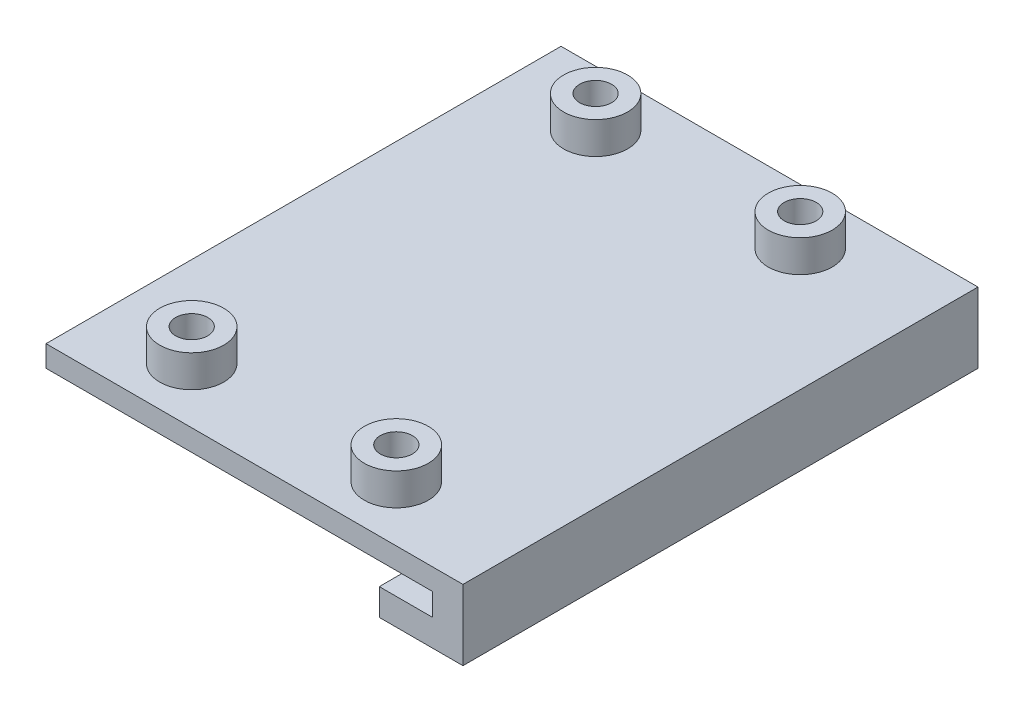
ISO-10303-21;
HEADER;
FILE_DESCRIPTION(('STEP AP214'),'2;1');
FILE_NAME('part.step','',(''),(''),'','','');
FILE_SCHEMA(('AUTOMOTIVE_DESIGN { 1 0 10303 214 1 1 1 1 }'));
ENDSEC;
DATA;
#1=APPLICATION_CONTEXT('core data for automotive mechanical design processes');
#2=APPLICATION_PROTOCOL_DEFINITION('international standard','automotive_design',2000,#1);
#3=PRODUCT_CONTEXT('',#1,'mechanical');
#4=PRODUCT('Part','Part','',(#3));
#5=PRODUCT_RELATED_PRODUCT_CATEGORY('part','',(#4));
#6=PRODUCT_DEFINITION_FORMATION('','',#4);
#7=PRODUCT_DEFINITION_CONTEXT('part definition',#1,'design');
#8=PRODUCT_DEFINITION('design','',#6,#7);
#9=PRODUCT_DEFINITION_SHAPE('','',#8);
#10=(LENGTH_UNIT() NAMED_UNIT(*) SI_UNIT(.MILLI.,.METRE.));
#11=(NAMED_UNIT(*) PLANE_ANGLE_UNIT() SI_UNIT($,.RADIAN.));
#12=(NAMED_UNIT(*) SI_UNIT($,.STERADIAN.) SOLID_ANGLE_UNIT());
#13=UNCERTAINTY_MEASURE_WITH_UNIT(LENGTH_MEASURE(1.E-05),#10,'distance_accuracy_value','');
#14=(GEOMETRIC_REPRESENTATION_CONTEXT(3) GLOBAL_UNCERTAINTY_ASSIGNED_CONTEXT((#13)) GLOBAL_UNIT_ASSIGNED_CONTEXT((#10,
#11,#12)) REPRESENTATION_CONTEXT('',''));
#15=CARTESIAN_POINT('',(0.,0.,0.));
#16=DIRECTION('',(0.,0.,1.));
#17=DIRECTION('',(1.,0.,0.));
#18=AXIS2_PLACEMENT_3D('',#15,#16,#17);
#19=CARTESIAN_POINT('',(18.194405421184,-4.6,-24.13));
#20=DIRECTION('',(1.,0.,0.));
#21=DIRECTION('',(0.,0.,-1.));
#22=AXIS2_PLACEMENT_3D('',#19,#20,#21);
#23=PLANE('',#22);
#24=DIRECTION('',(0.,0.,-1.));
#25=VECTOR('',#24,1.);
#26=CARTESIAN_POINT('',(18.194405421184,-2.1,24.13));
#27=LINE('',#26,#25);
#28=CARTESIAN_POINT('',(18.194405421184,-2.1,24.13));
#29=VERTEX_POINT('',#28);
#30=CARTESIAN_POINT('',(18.194405421184,-2.10000000000001,-24.13));
#31=VERTEX_POINT('',#30);
#32=EDGE_CURVE('E206',#29,#31,#27,.T.);
#33=ORIENTED_EDGE('',*,*,#32,.F.);
#34=DIRECTION('',(0.,1.,0.));
#35=VECTOR('',#34,1.);
#36=CARTESIAN_POINT('',(18.194405421184,-4.6,24.13));
#37=LINE('',#36,#35);
#38=CARTESIAN_POINT('',(18.194405421184,0.,24.13));
#39=VERTEX_POINT('',#38);
#40=EDGE_CURVE('E48',#29,#39,#37,.T.);
#41=ORIENTED_EDGE('',*,*,#40,.T.);
#42=DIRECTION('',(0.,0.,-1.));
#43=VECTOR('',#42,1.);
#44=CARTESIAN_POINT('',(18.194405421184,0.,-24.13));
#45=LINE('',#44,#43);
#46=CARTESIAN_POINT('',(18.194405421184,0.,-24.13));
#47=VERTEX_POINT('',#46);
#48=EDGE_CURVE('E90',#39,#47,#45,.T.);
#49=ORIENTED_EDGE('',*,*,#48,.T.);
#50=DIRECTION('',(0.,1.,0.));
#51=VECTOR('',#50,1.);
#52=CARTESIAN_POINT('',(18.194405421184,-4.6,-24.13));
#53=LINE('',#52,#51);
#54=EDGE_CURVE('E181',#31,#47,#53,.T.);
#55=ORIENTED_EDGE('',*,*,#54,.F.);
#56=EDGE_LOOP('',(#33,#41,#49,#55));
#57=FACE_BOUND('',#56,.T.);
#58=ADVANCED_FACE('F33',(#57),#23,.F.);
#59=CARTESIAN_POINT('',(0.,0.,0.));
#60=DIRECTION('',(0.,1.,0.));
#61=DIRECTION('',(0.,0.,1.));
#62=AXIS2_PLACEMENT_3D('',#59,#60,#61);
#63=PLANE('',#62);
#64=CARTESIAN_POINT('',(9.58566909872616,0.,-18.921));
#65=DIRECTION('',(0.,1.,0.));
#66=DIRECTION('',(0.,0.,1.));
#67=AXIS2_PLACEMENT_3D('',#64,#65,#66);
#68=CIRCLE('',#67,1.5);
#69=CARTESIAN_POINT('',(9.58566909872616,0.,-17.421));
#70=VERTEX_POINT('',#69);
#71=EDGE_CURVE('E162',#70,#70,#68,.T.);
#72=ORIENTED_EDGE('',*,*,#71,.T.);
#73=EDGE_LOOP('',(#72));
#74=FACE_BOUND('',#73,.T.);
#75=CARTESIAN_POINT('',(9.58566909872616,0.,18.925));
#76=DIRECTION('',(0.,1.,0.));
#77=DIRECTION('',(0.,0.,1.));
#78=AXIS2_PLACEMENT_3D('',#75,#76,#77);
#79=CIRCLE('',#78,1.5);
#80=CARTESIAN_POINT('',(9.58566909872616,0.,20.425));
#81=VERTEX_POINT('',#80);
#82=EDGE_CURVE('E156',#81,#81,#79,.T.);
#83=ORIENTED_EDGE('',*,*,#82,.T.);
#84=EDGE_LOOP('',(#83));
#85=FACE_BOUND('',#84,.T.);
#86=CARTESIAN_POINT('',(-9.58566909872616,0.,-18.921));
#87=DIRECTION('',(0.,-1.,0.));
#88=DIRECTION('',(0.,0.,1.));
#89=AXIS2_PLACEMENT_3D('',#86,#87,#88);
#90=CIRCLE('',#89,1.5);
#91=CARTESIAN_POINT('',(-9.58566909872616,0.,-17.421));
#92=VERTEX_POINT('',#91);
#93=EDGE_CURVE('E144',#92,#92,#90,.T.);
#94=ORIENTED_EDGE('',*,*,#93,.F.);
#95=EDGE_LOOP('',(#94));
#96=FACE_BOUND('',#95,.T.);
#97=CARTESIAN_POINT('',(-9.58566909872616,0.,18.925));
#98=DIRECTION('',(0.,-1.,0.));
#99=DIRECTION('',(0.,0.,1.));
#100=AXIS2_PLACEMENT_3D('',#97,#98,#99);
#101=CIRCLE('',#100,1.5);
#102=CARTESIAN_POINT('',(-9.58566909872616,0.,20.425));
#103=VERTEX_POINT('',#102);
#104=EDGE_CURVE('E137',#103,#103,#101,.T.);
#105=ORIENTED_EDGE('',*,*,#104,.F.);
#106=EDGE_LOOP('',(#105));
#107=FACE_BOUND('',#106,.T.);
#108=ORIENTED_EDGE('',*,*,#48,.F.);
#109=DIRECTION('',(1.,0.,0.));
#110=VECTOR('',#109,1.);
#111=CARTESIAN_POINT('',(-18.034,0.,24.13));
#112=LINE('',#111,#110);
#113=CARTESIAN_POINT('',(-18.034,0.,24.13));
#114=VERTEX_POINT('',#113);
#115=EDGE_CURVE('E80',#114,#39,#112,.T.);
#116=ORIENTED_EDGE('',*,*,#115,.F.);
#117=DIRECTION('',(0.,0.,1.));
#118=VECTOR('',#117,1.);
#119=CARTESIAN_POINT('',(-18.034,0.,-24.13));
#120=LINE('',#119,#118);
#121=CARTESIAN_POINT('',(-18.034,0.,-24.13));
#122=VERTEX_POINT('',#121);
#123=EDGE_CURVE('E70',#122,#114,#120,.T.);
#124=ORIENTED_EDGE('',*,*,#123,.F.);
#125=DIRECTION('',(-1.,0.,0.));
#126=VECTOR('',#125,1.);
#127=CARTESIAN_POINT('',(-18.034,0.,-24.13));
#128=LINE('',#127,#126);
#129=EDGE_CURVE('E81',#47,#122,#128,.T.);
#130=ORIENTED_EDGE('',*,*,#129,.F.);
#131=EDGE_LOOP('',(#108,#116,#124,#130));
#132=FACE_BOUND('',#131,.T.);
#133=ADVANCED_FACE('F89',(#74,#85,#96,#107,#132),#63,.F.);
#134=CARTESIAN_POINT('',(-18.034,2.,-24.13));
#135=DIRECTION('',(0.,0.,1.));
#136=DIRECTION('',(1.,0.,0.));
#137=AXIS2_PLACEMENT_3D('',#134,#135,#136);
#138=PLANE('',#137);
#139=DIRECTION('',(0.,1.,0.));
#140=VECTOR('',#139,1.);
#141=CARTESIAN_POINT('',(21.034,2.,-24.13));
#142=LINE('',#141,#140);
#143=CARTESIAN_POINT('',(21.034,-4.6,-24.13));
#144=VERTEX_POINT('',#143);
#145=CARTESIAN_POINT('',(21.034,2.,-24.13));
#146=VERTEX_POINT('',#145);
#147=EDGE_CURVE('E128',#144,#146,#142,.T.);
#148=ORIENTED_EDGE('',*,*,#147,.F.);
#149=DIRECTION('',(1.,0.,0.));
#150=VECTOR('',#149,1.);
#151=CARTESIAN_POINT('',(21.034,-4.6,-24.13));
#152=LINE('',#151,#150);
#153=CARTESIAN_POINT('',(13.194405421184,-4.6,-24.13));
#154=VERTEX_POINT('',#153);
#155=EDGE_CURVE('E194',#154,#144,#152,.T.);
#156=ORIENTED_EDGE('',*,*,#155,.F.);
#157=DIRECTION('',(0.,-1.,0.));
#158=VECTOR('',#157,1.);
#159=CARTESIAN_POINT('',(13.194405421184,-4.6,-24.13));
#160=LINE('',#159,#158);
#161=CARTESIAN_POINT('',(13.194405421184,-2.10000000000001,-24.13));
#162=VERTEX_POINT('',#161);
#163=EDGE_CURVE('E211',#162,#154,#160,.T.);
#164=ORIENTED_EDGE('',*,*,#163,.F.);
#165=DIRECTION('',(1.,0.,0.));
#166=VECTOR('',#165,1.);
#167=CARTESIAN_POINT('',(13.194405421184,-2.10000000000001,-24.13));
#168=LINE('',#167,#166);
#169=EDGE_CURVE('E190',#162,#31,#168,.T.);
#170=ORIENTED_EDGE('',*,*,#169,.T.);
#171=ORIENTED_EDGE('',*,*,#54,.T.);
#172=ORIENTED_EDGE('',*,*,#129,.T.);
#173=DIRECTION('',(0.,-1.,0.));
#174=VECTOR('',#173,1.);
#175=CARTESIAN_POINT('',(-18.034,2.,-24.13));
#176=LINE('',#175,#174);
#177=CARTESIAN_POINT('',(-18.034,2.,-24.13));
#178=VERTEX_POINT('',#177);
#179=EDGE_CURVE('E76',#178,#122,#176,.T.);
#180=ORIENTED_EDGE('',*,*,#179,.F.);
#181=DIRECTION('',(-1.,0.,0.));
#182=VECTOR('',#181,1.);
#183=CARTESIAN_POINT('',(-18.034,2.,-24.13));
#184=LINE('',#183,#182);
#185=EDGE_CURVE('E91',#146,#178,#184,.T.);
#186=ORIENTED_EDGE('',*,*,#185,.F.);
#187=EDGE_LOOP('',(#148,#156,#164,#170,#171,#172,#180,#186));
#188=FACE_BOUND('',#187,.T.);
#189=ADVANCED_FACE('F35',(#188),#138,.F.);
#190=CARTESIAN_POINT('',(-18.034,2.,-24.13));
#191=DIRECTION('',(1.,0.,0.));
#192=DIRECTION('',(0.,0.,-1.));
#193=AXIS2_PLACEMENT_3D('',#190,#191,#192);
#194=PLANE('',#193);
#195=ORIENTED_EDGE('',*,*,#123,.T.);
#196=DIRECTION('',(0.,-1.,0.));
#197=VECTOR('',#196,1.);
#198=CARTESIAN_POINT('',(-18.034,2.,24.13));
#199=LINE('',#198,#197);
#200=CARTESIAN_POINT('',(-18.034,2.,24.13));
#201=VERTEX_POINT('',#200);
#202=EDGE_CURVE('E73',#201,#114,#199,.T.);
#203=ORIENTED_EDGE('',*,*,#202,.F.);
#204=DIRECTION('',(0.,0.,1.));
#205=VECTOR('',#204,1.);
#206=CARTESIAN_POINT('',(-18.034,2.,-24.13));
#207=LINE('',#206,#205);
#208=EDGE_CURVE('E57',#178,#201,#207,.T.);
#209=ORIENTED_EDGE('',*,*,#208,.F.);
#210=ORIENTED_EDGE('',*,*,#179,.T.);
#211=EDGE_LOOP('',(#195,#203,#209,#210));
#212=FACE_BOUND('',#211,.T.);
#213=ADVANCED_FACE('F72',(#212),#194,.F.);
#214=CARTESIAN_POINT('',(-18.034,2.,24.13));
#215=DIRECTION('',(0.,0.,-1.));
#216=DIRECTION('',(-1.,0.,0.));
#217=AXIS2_PLACEMENT_3D('',#214,#215,#216);
#218=PLANE('',#217);
#219=ORIENTED_EDGE('',*,*,#115,.T.);
#220=ORIENTED_EDGE('',*,*,#40,.F.);
#221=DIRECTION('',(1.,0.,0.));
#222=VECTOR('',#221,1.);
#223=CARTESIAN_POINT('',(13.194405421184,-2.1,24.13));
#224=LINE('',#223,#222);
#225=CARTESIAN_POINT('',(13.194405421184,-2.1,24.13));
#226=VERTEX_POINT('',#225);
#227=EDGE_CURVE('E186',#226,#29,#224,.T.);
#228=ORIENTED_EDGE('',*,*,#227,.F.);
#229=DIRECTION('',(0.,1.,0.));
#230=VECTOR('',#229,1.);
#231=CARTESIAN_POINT('',(13.194405421184,-4.6,24.13));
#232=LINE('',#231,#230);
#233=CARTESIAN_POINT('',(13.194405421184,-4.6,24.13));
#234=VERTEX_POINT('',#233);
#235=EDGE_CURVE('E209',#234,#226,#232,.T.);
#236=ORIENTED_EDGE('',*,*,#235,.F.);
#237=DIRECTION('',(-1.,0.,0.));
#238=VECTOR('',#237,1.);
#239=CARTESIAN_POINT('',(21.034,-4.6,24.13));
#240=LINE('',#239,#238);
#241=CARTESIAN_POINT('',(21.034,-4.6,24.13));
#242=VERTEX_POINT('',#241);
#243=EDGE_CURVE('E132',#242,#234,#240,.T.);
#244=ORIENTED_EDGE('',*,*,#243,.F.);
#245=DIRECTION('',(0.,-1.,0.));
#246=VECTOR('',#245,1.);
#247=CARTESIAN_POINT('',(21.034,2.,24.13));
#248=LINE('',#247,#246);
#249=CARTESIAN_POINT('',(21.034,2.,24.13));
#250=VERTEX_POINT('',#249);
#251=EDGE_CURVE('E125',#250,#242,#248,.T.);
#252=ORIENTED_EDGE('',*,*,#251,.F.);
#253=DIRECTION('',(1.,0.,0.));
#254=VECTOR('',#253,1.);
#255=CARTESIAN_POINT('',(-18.034,2.,24.13));
#256=LINE('',#255,#254);
#257=EDGE_CURVE('E87',#201,#250,#256,.T.);
#258=ORIENTED_EDGE('',*,*,#257,.F.);
#259=ORIENTED_EDGE('',*,*,#202,.T.);
#260=EDGE_LOOP('',(#219,#220,#228,#236,#244,#252,#258,#259));
#261=FACE_BOUND('',#260,.T.);
#262=ADVANCED_FACE('F85',(#261),#218,.F.);
#263=CARTESIAN_POINT('',(0.,2.,0.));
#264=DIRECTION('',(0.,1.,0.));
#265=DIRECTION('',(0.,0.,1.));
#266=AXIS2_PLACEMENT_3D('',#263,#264,#265);
#267=PLANE('',#266);
#268=CARTESIAN_POINT('',(-9.58566909872616,2.,18.925));
#269=DIRECTION('',(0.,1.,0.));
#270=DIRECTION('',(0.,0.,1.));
#271=AXIS2_PLACEMENT_3D('',#268,#269,#270);
#272=CIRCLE('',#271,3.);
#273=CARTESIAN_POINT('',(-9.58566909872616,2.,21.925));
#274=VERTEX_POINT('',#273);
#275=EDGE_CURVE('E11',#274,#274,#272,.T.);
#276=ORIENTED_EDGE('',*,*,#275,.F.);
#277=EDGE_LOOP('',(#276));
#278=FACE_BOUND('',#277,.T.);
#279=CARTESIAN_POINT('',(-9.58566909872616,2.,-18.921));
#280=DIRECTION('',(0.,1.,0.));
#281=DIRECTION('',(0.,0.,1.));
#282=AXIS2_PLACEMENT_3D('',#279,#280,#281);
#283=CIRCLE('',#282,3.);
#284=CARTESIAN_POINT('',(-9.58566909872616,2.,-15.921));
#285=VERTEX_POINT('',#284);
#286=EDGE_CURVE('E41',#285,#285,#283,.T.);
#287=ORIENTED_EDGE('',*,*,#286,.F.);
#288=EDGE_LOOP('',(#287));
#289=FACE_BOUND('',#288,.T.);
#290=CARTESIAN_POINT('',(9.58566909872616,2.,18.925));
#291=DIRECTION('',(0.,1.,0.));
#292=DIRECTION('',(0.,0.,1.));
#293=AXIS2_PLACEMENT_3D('',#290,#291,#292);
#294=CIRCLE('',#293,3.);
#295=CARTESIAN_POINT('',(9.58566909872616,2.,21.925));
#296=VERTEX_POINT('',#295);
#297=EDGE_CURVE('E110',#296,#296,#294,.T.);
#298=ORIENTED_EDGE('',*,*,#297,.F.);
#299=EDGE_LOOP('',(#298));
#300=FACE_BOUND('',#299,.T.);
#301=CARTESIAN_POINT('',(9.58566909872616,2.,-18.921));
#302=DIRECTION('',(0.,1.,0.));
#303=DIRECTION('',(0.,0.,1.));
#304=AXIS2_PLACEMENT_3D('',#301,#302,#303);
#305=CIRCLE('',#304,3.);
#306=CARTESIAN_POINT('',(9.58566909872616,2.,-15.921));
#307=VERTEX_POINT('',#306);
#308=EDGE_CURVE('E113',#307,#307,#305,.T.);
#309=ORIENTED_EDGE('',*,*,#308,.F.);
#310=EDGE_LOOP('',(#309));
#311=FACE_BOUND('',#310,.T.);
#312=ORIENTED_EDGE('',*,*,#257,.T.);
#313=DIRECTION('',(0.,0.,1.));
#314=VECTOR('',#313,1.);
#315=CARTESIAN_POINT('',(21.034,2.,-24.13));
#316=LINE('',#315,#314);
#317=EDGE_CURVE('E117',#146,#250,#316,.T.);
#318=ORIENTED_EDGE('',*,*,#317,.F.);
#319=ORIENTED_EDGE('',*,*,#185,.T.);
#320=ORIENTED_EDGE('',*,*,#208,.T.);
#321=EDGE_LOOP('',(#312,#318,#319,#320));
#322=FACE_BOUND('',#321,.T.);
#323=ADVANCED_FACE('F101',(#278,#289,#300,#311,#322),#267,.T.);
#324=CARTESIAN_POINT('',(9.58566909872616,5.,-18.921));
#325=DIRECTION('',(0.,-1.,0.));
#326=DIRECTION('',(0.,0.,-1.));
#327=AXIS2_PLACEMENT_3D('',#324,#325,#326);
#328=CYLINDRICAL_SURFACE('',#327,3.);
#329=CARTESIAN_POINT('',(9.58566909872616,5.,-18.921));
#330=DIRECTION('',(0.,1.,0.));
#331=DIRECTION('',(0.,0.,1.));
#332=AXIS2_PLACEMENT_3D('',#329,#330,#331);
#333=CIRCLE('',#332,3.);
#334=CARTESIAN_POINT('',(9.58566909872616,5.,-15.921));
#335=VERTEX_POINT('',#334);
#336=EDGE_CURVE('E171',#335,#335,#333,.T.);
#337=ORIENTED_EDGE('',*,*,#336,.F.);
#338=EDGE_LOOP('',(#337));
#339=FACE_BOUND('',#338,.T.);
#340=ORIENTED_EDGE('',*,*,#308,.T.);
#341=EDGE_LOOP('',(#340));
#342=FACE_BOUND('',#341,.T.);
#343=ADVANCED_FACE('F104',(#339,#342),#328,.T.);
#344=CARTESIAN_POINT('',(9.58566909872616,5.,-18.921));
#345=DIRECTION('',(0.,1.,0.));
#346=DIRECTION('',(0.,0.,1.));
#347=AXIS2_PLACEMENT_3D('',#344,#345,#346);
#348=PLANE('',#347);
#349=CARTESIAN_POINT('',(9.58566909872616,5.,-18.921));
#350=DIRECTION('',(0.,1.,0.));
#351=DIRECTION('',(0.,0.,1.));
#352=AXIS2_PLACEMENT_3D('',#349,#350,#351);
#353=CIRCLE('',#352,1.5);
#354=CARTESIAN_POINT('',(9.58566909872616,5.,-17.421));
#355=VERTEX_POINT('',#354);
#356=EDGE_CURVE('E159',#355,#355,#353,.T.);
#357=ORIENTED_EDGE('',*,*,#356,.F.);
#358=EDGE_LOOP('',(#357));
#359=FACE_BOUND('',#358,.T.);
#360=ORIENTED_EDGE('',*,*,#336,.T.);
#361=EDGE_LOOP('',(#360));
#362=FACE_BOUND('',#361,.T.);
#363=ADVANCED_FACE('F294',(#359,#362),#348,.T.);
#364=CARTESIAN_POINT('',(9.58566909872616,5.,18.925));
#365=DIRECTION('',(0.,-1.,0.));
#366=DIRECTION('',(0.,0.,-1.));
#367=AXIS2_PLACEMENT_3D('',#364,#365,#366);
#368=CYLINDRICAL_SURFACE('',#367,3.);
#369=CARTESIAN_POINT('',(9.58566909872616,5.,18.925));
#370=DIRECTION('',(0.,1.,0.));
#371=DIRECTION('',(0.,0.,1.));
#372=AXIS2_PLACEMENT_3D('',#369,#370,#371);
#373=CIRCLE('',#372,3.);
#374=CARTESIAN_POINT('',(9.58566909872616,5.,21.925));
#375=VERTEX_POINT('',#374);
#376=EDGE_CURVE('E167',#375,#375,#373,.T.);
#377=ORIENTED_EDGE('',*,*,#376,.F.);
#378=EDGE_LOOP('',(#377));
#379=FACE_BOUND('',#378,.T.);
#380=ORIENTED_EDGE('',*,*,#297,.T.);
#381=EDGE_LOOP('',(#380));
#382=FACE_BOUND('',#381,.T.);
#383=ADVANCED_FACE('F290',(#379,#382),#368,.T.);
#384=CARTESIAN_POINT('',(9.58566909872616,5.,18.925));
#385=DIRECTION('',(0.,1.,0.));
#386=DIRECTION('',(0.,0.,1.));
#387=AXIS2_PLACEMENT_3D('',#384,#385,#386);
#388=PLANE('',#387);
#389=CARTESIAN_POINT('',(9.58566909872616,5.,18.925));
#390=DIRECTION('',(0.,1.,0.));
#391=DIRECTION('',(0.,0.,1.));
#392=AXIS2_PLACEMENT_3D('',#389,#390,#391);
#393=CIRCLE('',#392,1.5);
#394=CARTESIAN_POINT('',(9.58566909872616,5.,20.425));
#395=VERTEX_POINT('',#394);
#396=EDGE_CURVE('E155',#395,#395,#393,.T.);
#397=ORIENTED_EDGE('',*,*,#396,.F.);
#398=EDGE_LOOP('',(#397));
#399=FACE_BOUND('',#398,.T.);
#400=ORIENTED_EDGE('',*,*,#376,.T.);
#401=EDGE_LOOP('',(#400));
#402=FACE_BOUND('',#401,.T.);
#403=ADVANCED_FACE('F286',(#399,#402),#388,.T.);
#404=CARTESIAN_POINT('',(9.58566909872616,0.,-18.921));
#405=DIRECTION('',(0.,1.,0.));
#406=DIRECTION('',(0.,0.,1.));
#407=AXIS2_PLACEMENT_3D('',#404,#405,#406);
#408=CYLINDRICAL_SURFACE('',#407,1.5);
#409=ORIENTED_EDGE('',*,*,#71,.F.);
#410=EDGE_LOOP('',(#409));
#411=FACE_BOUND('',#410,.T.);
#412=ORIENTED_EDGE('',*,*,#356,.T.);
#413=EDGE_LOOP('',(#412));
#414=FACE_BOUND('',#413,.T.);
#415=ADVANCED_FACE('F282',(#411,#414),#408,.F.);
#416=CARTESIAN_POINT('',(9.58566909872616,0.,18.925));
#417=DIRECTION('',(0.,1.,0.));
#418=DIRECTION('',(0.,0.,1.));
#419=AXIS2_PLACEMENT_3D('',#416,#417,#418);
#420=CYLINDRICAL_SURFACE('',#419,1.5);
#421=ORIENTED_EDGE('',*,*,#82,.F.);
#422=EDGE_LOOP('',(#421));
#423=FACE_BOUND('',#422,.T.);
#424=ORIENTED_EDGE('',*,*,#396,.T.);
#425=EDGE_LOOP('',(#424));
#426=FACE_BOUND('',#425,.T.);
#427=ADVANCED_FACE('F278',(#423,#426),#420,.F.);
#428=CARTESIAN_POINT('',(-9.58566909872616,5.,-18.921));
#429=DIRECTION('',(0.,-1.,0.));
#430=DIRECTION('',(0.,0.,-1.));
#431=AXIS2_PLACEMENT_3D('',#428,#429,#430);
#432=CYLINDRICAL_SURFACE('',#431,3.);
#433=CARTESIAN_POINT('',(-9.58566909872616,5.,-18.921));
#434=DIRECTION('',(0.,-1.,0.));
#435=DIRECTION('',(0.,0.,1.));
#436=AXIS2_PLACEMENT_3D('',#433,#434,#435);
#437=CIRCLE('',#436,3.);
#438=CARTESIAN_POINT('',(-9.58566909872616,5.,-15.921));
#439=VERTEX_POINT('',#438);
#440=EDGE_CURVE('E152',#439,#439,#437,.T.);
#441=ORIENTED_EDGE('',*,*,#440,.T.);
#442=EDGE_LOOP('',(#441));
#443=FACE_BOUND('',#442,.T.);
#444=ORIENTED_EDGE('',*,*,#286,.T.);
#445=EDGE_LOOP('',(#444));
#446=FACE_BOUND('',#445,.T.);
#447=ADVANCED_FACE('F99',(#443,#446),#432,.T.);
#448=CARTESIAN_POINT('',(-9.58566909872616,5.,-18.921));
#449=DIRECTION('',(0.,1.,0.));
#450=DIRECTION('',(0.,0.,1.));
#451=AXIS2_PLACEMENT_3D('',#448,#449,#450);
#452=PLANE('',#451);
#453=CARTESIAN_POINT('',(-9.58566909872616,5.,-18.921));
#454=DIRECTION('',(0.,-1.,0.));
#455=DIRECTION('',(0.,0.,1.));
#456=AXIS2_PLACEMENT_3D('',#453,#454,#455);
#457=CIRCLE('',#456,1.5);
#458=CARTESIAN_POINT('',(-9.58566909872616,5.,-17.421));
#459=VERTEX_POINT('',#458);
#460=EDGE_CURVE('E142',#459,#459,#457,.T.);
#461=ORIENTED_EDGE('',*,*,#460,.T.);
#462=EDGE_LOOP('',(#461));
#463=FACE_BOUND('',#462,.T.);
#464=ORIENTED_EDGE('',*,*,#440,.F.);
#465=EDGE_LOOP('',(#464));
#466=FACE_BOUND('',#465,.T.);
#467=ADVANCED_FACE('F271',(#463,#466),#452,.T.);
#468=CARTESIAN_POINT('',(-9.58566909872616,5.,18.925));
#469=DIRECTION('',(0.,-1.,0.));
#470=DIRECTION('',(0.,0.,-1.));
#471=AXIS2_PLACEMENT_3D('',#468,#469,#470);
#472=CYLINDRICAL_SURFACE('',#471,3.);
#473=CARTESIAN_POINT('',(-9.58566909872616,5.,18.925));
#474=DIRECTION('',(0.,-1.,0.));
#475=DIRECTION('',(0.,0.,1.));
#476=AXIS2_PLACEMENT_3D('',#473,#474,#475);
#477=CIRCLE('',#476,3.);
#478=CARTESIAN_POINT('',(-9.58566909872616,5.,21.925));
#479=VERTEX_POINT('',#478);
#480=EDGE_CURVE('E147',#479,#479,#477,.T.);
#481=ORIENTED_EDGE('',*,*,#480,.T.);
#482=EDGE_LOOP('',(#481));
#483=FACE_BOUND('',#482,.T.);
#484=ORIENTED_EDGE('',*,*,#275,.T.);
#485=EDGE_LOOP('',(#484));
#486=FACE_BOUND('',#485,.T.);
#487=ADVANCED_FACE('F267',(#483,#486),#472,.T.);
#488=CARTESIAN_POINT('',(-9.58566909872616,5.,18.925));
#489=DIRECTION('',(0.,1.,0.));
#490=DIRECTION('',(0.,0.,1.));
#491=AXIS2_PLACEMENT_3D('',#488,#489,#490);
#492=PLANE('',#491);
#493=CARTESIAN_POINT('',(-9.58566909872616,5.,18.925));
#494=DIRECTION('',(0.,-1.,0.));
#495=DIRECTION('',(0.,0.,1.));
#496=AXIS2_PLACEMENT_3D('',#493,#494,#495);
#497=CIRCLE('',#496,1.5);
#498=CARTESIAN_POINT('',(-9.58566909872616,5.,20.425));
#499=VERTEX_POINT('',#498);
#500=EDGE_CURVE('E134',#499,#499,#497,.T.);
#501=ORIENTED_EDGE('',*,*,#500,.T.);
#502=EDGE_LOOP('',(#501));
#503=FACE_BOUND('',#502,.T.);
#504=ORIENTED_EDGE('',*,*,#480,.F.);
#505=EDGE_LOOP('',(#504));
#506=FACE_BOUND('',#505,.T.);
#507=ADVANCED_FACE('F263',(#503,#506),#492,.T.);
#508=CARTESIAN_POINT('',(-9.58566909872616,0.,-18.921));
#509=DIRECTION('',(0.,1.,0.));
#510=DIRECTION('',(0.,0.,1.));
#511=AXIS2_PLACEMENT_3D('',#508,#509,#510);
#512=CYLINDRICAL_SURFACE('',#511,1.5);
#513=ORIENTED_EDGE('',*,*,#93,.T.);
#514=EDGE_LOOP('',(#513));
#515=FACE_BOUND('',#514,.T.);
#516=ORIENTED_EDGE('',*,*,#460,.F.);
#517=EDGE_LOOP('',(#516));
#518=FACE_BOUND('',#517,.T.);
#519=ADVANCED_FACE('F259',(#515,#518),#512,.F.);
#520=CARTESIAN_POINT('',(-9.58566909872616,0.,18.925));
#521=DIRECTION('',(0.,1.,0.));
#522=DIRECTION('',(0.,0.,1.));
#523=AXIS2_PLACEMENT_3D('',#520,#521,#522);
#524=CYLINDRICAL_SURFACE('',#523,1.5);
#525=ORIENTED_EDGE('',*,*,#104,.T.);
#526=EDGE_LOOP('',(#525));
#527=FACE_BOUND('',#526,.T.);
#528=ORIENTED_EDGE('',*,*,#500,.F.);
#529=EDGE_LOOP('',(#528));
#530=FACE_BOUND('',#529,.T.);
#531=ADVANCED_FACE('F246',(#527,#530),#524,.F.);
#532=CARTESIAN_POINT('',(21.034,0.,0.));
#533=DIRECTION('',(-1.,0.,0.));
#534=DIRECTION('',(0.,0.,1.));
#535=AXIS2_PLACEMENT_3D('',#532,#533,#534);
#536=PLANE('',#535);
#537=ORIENTED_EDGE('',*,*,#147,.T.);
#538=ORIENTED_EDGE('',*,*,#317,.T.);
#539=ORIENTED_EDGE('',*,*,#251,.T.);
#540=DIRECTION('',(0.,0.,1.));
#541=VECTOR('',#540,1.);
#542=CARTESIAN_POINT('',(21.034,-4.6,-24.13));
#543=LINE('',#542,#541);
#544=EDGE_CURVE('E185',#144,#242,#543,.T.);
#545=ORIENTED_EDGE('',*,*,#544,.F.);
#546=EDGE_LOOP('',(#537,#538,#539,#545));
#547=FACE_BOUND('',#546,.T.);
#548=ADVANCED_FACE('F122',(#547),#536,.F.);
#549=CARTESIAN_POINT('',(0.,-4.6,0.));
#550=DIRECTION('',(0.,-1.,0.));
#551=DIRECTION('',(0.,0.,-1.));
#552=AXIS2_PLACEMENT_3D('',#549,#550,#551);
#553=PLANE('',#552);
#554=ORIENTED_EDGE('',*,*,#544,.T.);
#555=ORIENTED_EDGE('',*,*,#243,.T.);
#556=DIRECTION('',(0.,0.,1.));
#557=VECTOR('',#556,1.);
#558=CARTESIAN_POINT('',(13.194405421184,-4.6,24.13));
#559=LINE('',#558,#557);
#560=EDGE_CURVE('E205',#154,#234,#559,.T.);
#561=ORIENTED_EDGE('',*,*,#560,.F.);
#562=ORIENTED_EDGE('',*,*,#155,.T.);
#563=EDGE_LOOP('',(#554,#555,#561,#562));
#564=FACE_BOUND('',#563,.T.);
#565=ADVANCED_FACE('F238',(#564),#553,.T.);
#566=CARTESIAN_POINT('',(13.194405421184,-2.1,24.13));
#567=DIRECTION('',(0.,-1.,0.));
#568=DIRECTION('',(0.,0.,-1.));
#569=AXIS2_PLACEMENT_3D('',#566,#567,#568);
#570=PLANE('',#569);
#571=ORIENTED_EDGE('',*,*,#32,.T.);
#572=ORIENTED_EDGE('',*,*,#169,.F.);
#573=DIRECTION('',(0.,0.,-1.));
#574=VECTOR('',#573,1.);
#575=CARTESIAN_POINT('',(13.194405421184,-2.1,24.13));
#576=LINE('',#575,#574);
#577=EDGE_CURVE('E214',#226,#162,#576,.T.);
#578=ORIENTED_EDGE('',*,*,#577,.F.);
#579=ORIENTED_EDGE('',*,*,#227,.T.);
#580=EDGE_LOOP('',(#571,#572,#578,#579));
#581=FACE_BOUND('',#580,.T.);
#582=ADVANCED_FACE('F228',(#581),#570,.F.);
#583=CARTESIAN_POINT('',(13.194405421184,0.,0.));
#584=DIRECTION('',(-1.,0.,0.));
#585=DIRECTION('',(0.,0.,1.));
#586=AXIS2_PLACEMENT_3D('',#583,#584,#585);
#587=PLANE('',#586);
#588=ORIENTED_EDGE('',*,*,#235,.T.);
#589=ORIENTED_EDGE('',*,*,#577,.T.);
#590=ORIENTED_EDGE('',*,*,#163,.T.);
#591=ORIENTED_EDGE('',*,*,#560,.T.);
#592=EDGE_LOOP('',(#588,#589,#590,#591));
#593=FACE_BOUND('',#592,.T.);
#594=ADVANCED_FACE('F221',(#593),#587,.T.);
#595=CLOSED_SHELL('',(#58,#133,#189,#213,#262,#323,#343,#363,#383,#403,#415,#427,#447,#467,#487,
#507,#519,#531,#548,#565,#582,#594));
#596=MANIFOLD_SOLID_BREP('B2',#595);
#597=ADVANCED_BREP_SHAPE_REPRESENTATION('',(#18,#596),#14);
#598=SHAPE_DEFINITION_REPRESENTATION(#9,#597);
ENDSEC;
END-ISO-10303-21;
